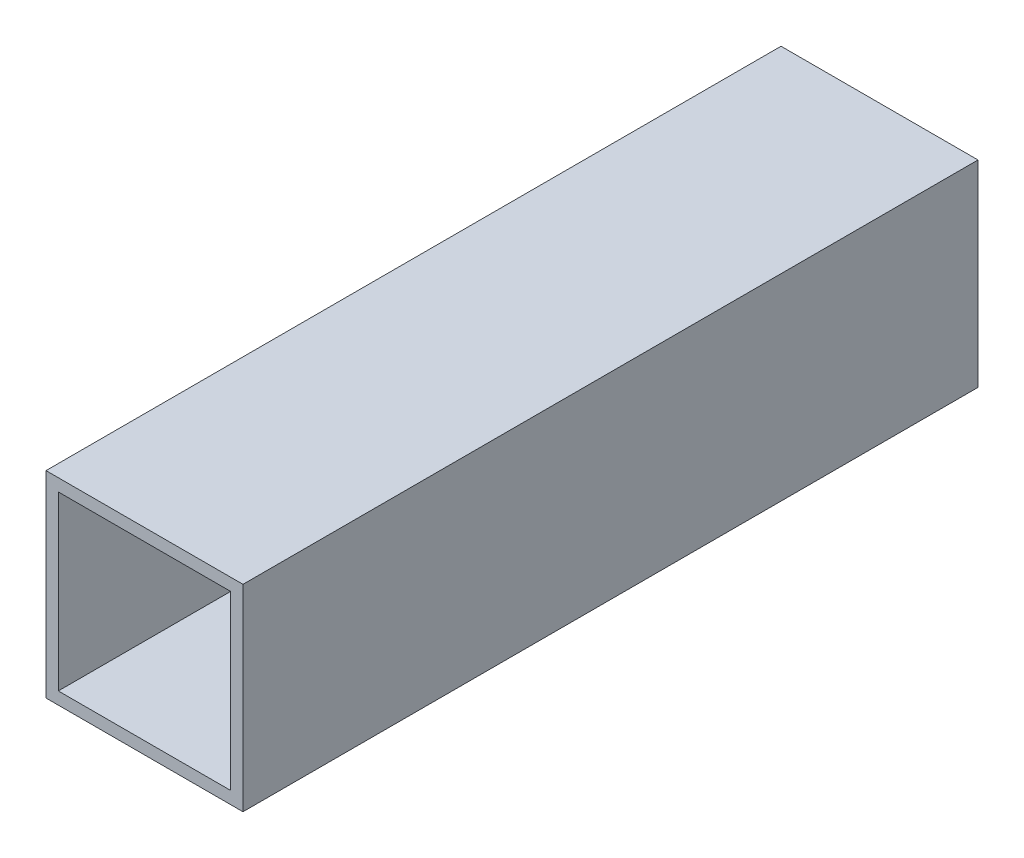
ISO-10303-21;
HEADER;
FILE_DESCRIPTION(('STEP AP214'),'2;1');
FILE_NAME('part.step','',(''),(''),'','','');
FILE_SCHEMA(('AUTOMOTIVE_DESIGN { 1 0 10303 214 1 1 1 1 }'));
ENDSEC;
DATA;
#1=APPLICATION_CONTEXT('core data for automotive mechanical design processes');
#2=APPLICATION_PROTOCOL_DEFINITION('international standard','automotive_design',2000,#1);
#3=PRODUCT_CONTEXT('',#1,'mechanical');
#4=PRODUCT('Part','Part','',(#3));
#5=PRODUCT_RELATED_PRODUCT_CATEGORY('part','',(#4));
#6=PRODUCT_DEFINITION_FORMATION('','',#4);
#7=PRODUCT_DEFINITION_CONTEXT('part definition',#1,'design');
#8=PRODUCT_DEFINITION('design','',#6,#7);
#9=PRODUCT_DEFINITION_SHAPE('','',#8);
#10=(LENGTH_UNIT() NAMED_UNIT(*) SI_UNIT(.MILLI.,.METRE.));
#11=(NAMED_UNIT(*) PLANE_ANGLE_UNIT() SI_UNIT($,.RADIAN.));
#12=(NAMED_UNIT(*) SI_UNIT($,.STERADIAN.) SOLID_ANGLE_UNIT());
#13=UNCERTAINTY_MEASURE_WITH_UNIT(LENGTH_MEASURE(1.E-05),#10,'distance_accuracy_value','');
#14=(GEOMETRIC_REPRESENTATION_CONTEXT(3) GLOBAL_UNCERTAINTY_ASSIGNED_CONTEXT((#13)) GLOBAL_UNIT_ASSIGNED_CONTEXT((#10,
#11,#12)) REPRESENTATION_CONTEXT('',''));
#15=CARTESIAN_POINT('',(0.,0.,0.));
#16=DIRECTION('',(0.,0.,1.));
#17=DIRECTION('',(1.,0.,0.));
#18=AXIS2_PLACEMENT_3D('',#15,#16,#17);
#19=CARTESIAN_POINT('',(0.,0.,94.78));
#20=DIRECTION('',(0.,0.,-1.));
#21=DIRECTION('',(-1.,0.,0.));
#22=AXIS2_PLACEMENT_3D('',#19,#20,#21);
#23=PLANE('',#22);
#24=DIRECTION('',(0.,1.,0.));
#25=VECTOR('',#24,1.);
#26=CARTESIAN_POINT('',(12.7,-12.7,94.78));
#27=LINE('',#26,#25);
#28=CARTESIAN_POINT('',(12.7,-12.7,94.78));
#29=VERTEX_POINT('',#28);
#30=CARTESIAN_POINT('',(12.7,12.7,94.78));
#31=VERTEX_POINT('',#30);
#32=EDGE_CURVE('E134',#29,#31,#27,.T.);
#33=ORIENTED_EDGE('',*,*,#32,.T.);
#34=DIRECTION('',(-1.,0.,0.));
#35=VECTOR('',#34,1.);
#36=CARTESIAN_POINT('',(-12.7,12.7,94.78));
#37=LINE('',#36,#35);
#38=CARTESIAN_POINT('',(-12.7,12.7,94.78));
#39=VERTEX_POINT('',#38);
#40=EDGE_CURVE('E137',#31,#39,#37,.T.);
#41=ORIENTED_EDGE('',*,*,#40,.T.);
#42=DIRECTION('',(0.,-1.,0.));
#43=VECTOR('',#42,1.);
#44=CARTESIAN_POINT('',(-12.7,-12.7,94.78));
#45=LINE('',#44,#43);
#46=CARTESIAN_POINT('',(-12.7,-12.7,94.78));
#47=VERTEX_POINT('',#46);
#48=EDGE_CURVE('E140',#39,#47,#45,.T.);
#49=ORIENTED_EDGE('',*,*,#48,.T.);
#50=DIRECTION('',(1.,0.,0.));
#51=VECTOR('',#50,1.);
#52=CARTESIAN_POINT('',(-12.7,-12.7,94.78));
#53=LINE('',#52,#51);
#54=EDGE_CURVE('E142',#47,#29,#53,.T.);
#55=ORIENTED_EDGE('',*,*,#54,.T.);
#56=EDGE_LOOP('',(#33,#41,#49,#55));
#57=FACE_BOUND('',#56,.T.);
#58=DIRECTION('',(0.,1.,0.));
#59=VECTOR('',#58,1.);
#60=CARTESIAN_POINT('',(11.1125,-11.1125000000001,94.78));
#61=LINE('',#60,#59);
#62=CARTESIAN_POINT('',(11.1125,-11.1125000000001,94.78));
#63=VERTEX_POINT('',#62);
#64=CARTESIAN_POINT('',(11.1125,11.1125,94.78));
#65=VERTEX_POINT('',#64);
#66=EDGE_CURVE('E98',#63,#65,#61,.T.);
#67=ORIENTED_EDGE('',*,*,#66,.F.);
#68=DIRECTION('',(1.,0.,0.));
#69=VECTOR('',#68,1.);
#70=CARTESIAN_POINT('',(-11.1125,-11.1125000000001,94.78));
#71=LINE('',#70,#69);
#72=CARTESIAN_POINT('',(-11.1125,-11.1125000000001,94.78));
#73=VERTEX_POINT('',#72);
#74=EDGE_CURVE('E120',#73,#63,#71,.T.);
#75=ORIENTED_EDGE('',*,*,#74,.F.);
#76=DIRECTION('',(0.,-1.,0.));
#77=VECTOR('',#76,1.);
#78=CARTESIAN_POINT('',(-11.1125,-11.1125000000001,94.78));
#79=LINE('',#78,#77);
#80=CARTESIAN_POINT('',(-11.1125,11.1125,94.78));
#81=VERTEX_POINT('',#80);
#82=EDGE_CURVE('E118',#81,#73,#79,.T.);
#83=ORIENTED_EDGE('',*,*,#82,.F.);
#84=DIRECTION('',(-1.,0.,0.));
#85=VECTOR('',#84,1.);
#86=CARTESIAN_POINT('',(-11.1125,11.1125,94.78));
#87=LINE('',#86,#85);
#88=EDGE_CURVE('E106',#65,#81,#87,.T.);
#89=ORIENTED_EDGE('',*,*,#88,.F.);
#90=EDGE_LOOP('',(#67,#75,#83,#89));
#91=FACE_BOUND('',#90,.T.);
#92=ADVANCED_FACE('F33',(#57,#91),#23,.F.);
#93=CARTESIAN_POINT('',(0.,0.,0.));
#94=DIRECTION('',(0.,0.,-1.));
#95=DIRECTION('',(-1.,0.,0.));
#96=AXIS2_PLACEMENT_3D('',#93,#94,#95);
#97=PLANE('',#96);
#98=DIRECTION('',(0.,1.,0.));
#99=VECTOR('',#98,1.);
#100=CARTESIAN_POINT('',(12.7,-12.7,0.));
#101=LINE('',#100,#99);
#102=CARTESIAN_POINT('',(12.7,-12.7,0.));
#103=VERTEX_POINT('',#102);
#104=CARTESIAN_POINT('',(12.7,12.7,0.));
#105=VERTEX_POINT('',#104);
#106=EDGE_CURVE('E114',#103,#105,#101,.T.);
#107=ORIENTED_EDGE('',*,*,#106,.F.);
#108=DIRECTION('',(1.,0.,0.));
#109=VECTOR('',#108,1.);
#110=CARTESIAN_POINT('',(-12.7,-12.7,0.));
#111=LINE('',#110,#109);
#112=CARTESIAN_POINT('',(-12.7,-12.7,0.));
#113=VERTEX_POINT('',#112);
#114=EDGE_CURVE('E138',#113,#103,#111,.T.);
#115=ORIENTED_EDGE('',*,*,#114,.F.);
#116=DIRECTION('',(0.,-1.,0.));
#117=VECTOR('',#116,1.);
#118=CARTESIAN_POINT('',(-12.7,-12.7,0.));
#119=LINE('',#118,#117);
#120=CARTESIAN_POINT('',(-12.7,12.7,0.));
#121=VERTEX_POINT('',#120);
#122=EDGE_CURVE('E149',#121,#113,#119,.T.);
#123=ORIENTED_EDGE('',*,*,#122,.F.);
#124=DIRECTION('',(-1.,0.,0.));
#125=VECTOR('',#124,1.);
#126=CARTESIAN_POINT('',(-12.7,12.7,0.));
#127=LINE('',#126,#125);
#128=EDGE_CURVE('E147',#105,#121,#127,.T.);
#129=ORIENTED_EDGE('',*,*,#128,.F.);
#130=EDGE_LOOP('',(#107,#115,#123,#129));
#131=FACE_BOUND('',#130,.T.);
#132=DIRECTION('',(1.,0.,0.));
#133=VECTOR('',#132,1.);
#134=CARTESIAN_POINT('',(-11.1125,-11.1125000000001,0.));
#135=LINE('',#134,#133);
#136=CARTESIAN_POINT('',(-11.1125,-11.1125000000001,0.));
#137=VERTEX_POINT('',#136);
#138=CARTESIAN_POINT('',(11.1125,-11.1125000000001,0.));
#139=VERTEX_POINT('',#138);
#140=EDGE_CURVE('E107',#137,#139,#135,.T.);
#141=ORIENTED_EDGE('',*,*,#140,.T.);
#142=DIRECTION('',(0.,1.,0.));
#143=VECTOR('',#142,1.);
#144=CARTESIAN_POINT('',(11.1125,-11.1125000000001,0.));
#145=LINE('',#144,#143);
#146=CARTESIAN_POINT('',(11.1125,11.1125,0.));
#147=VERTEX_POINT('',#146);
#148=EDGE_CURVE('E56',#139,#147,#145,.T.);
#149=ORIENTED_EDGE('',*,*,#148,.T.);
#150=DIRECTION('',(-1.,0.,0.));
#151=VECTOR('',#150,1.);
#152=CARTESIAN_POINT('',(-11.1125,11.1125,0.));
#153=LINE('',#152,#151);
#154=CARTESIAN_POINT('',(-11.1125,11.1125,0.));
#155=VERTEX_POINT('',#154);
#156=EDGE_CURVE('E113',#147,#155,#153,.T.);
#157=ORIENTED_EDGE('',*,*,#156,.T.);
#158=DIRECTION('',(0.,-1.,0.));
#159=VECTOR('',#158,1.);
#160=CARTESIAN_POINT('',(-11.1125,-11.1125000000001,0.));
#161=LINE('',#160,#159);
#162=EDGE_CURVE('E126',#155,#137,#161,.T.);
#163=ORIENTED_EDGE('',*,*,#162,.T.);
#164=EDGE_LOOP('',(#141,#149,#157,#163));
#165=FACE_BOUND('',#164,.T.);
#166=ADVANCED_FACE('F167',(#131,#165),#97,.T.);
#167=CARTESIAN_POINT('',(12.7,-12.7,94.78));
#168=DIRECTION('',(-1.,0.,0.));
#169=DIRECTION('',(0.,0.,1.));
#170=AXIS2_PLACEMENT_3D('',#167,#168,#169);
#171=PLANE('',#170);
#172=ORIENTED_EDGE('',*,*,#106,.T.);
#173=DIRECTION('',(0.,0.,-1.));
#174=VECTOR('',#173,1.);
#175=CARTESIAN_POINT('',(12.7,12.7,94.78));
#176=LINE('',#175,#174);
#177=EDGE_CURVE('E11',#31,#105,#176,.T.);
#178=ORIENTED_EDGE('',*,*,#177,.F.);
#179=ORIENTED_EDGE('',*,*,#32,.F.);
#180=DIRECTION('',(0.,0.,-1.));
#181=VECTOR('',#180,1.);
#182=CARTESIAN_POINT('',(12.7,-12.7,94.78));
#183=LINE('',#182,#181);
#184=EDGE_CURVE('E144',#29,#103,#183,.T.);
#185=ORIENTED_EDGE('',*,*,#184,.T.);
#186=EDGE_LOOP('',(#172,#178,#179,#185));
#187=FACE_BOUND('',#186,.T.);
#188=ADVANCED_FACE('F35',(#187),#171,.F.);
#189=CARTESIAN_POINT('',(-12.7,12.7,94.78));
#190=DIRECTION('',(0.,-1.,0.));
#191=DIRECTION('',(0.,0.,-1.));
#192=AXIS2_PLACEMENT_3D('',#189,#190,#191);
#193=PLANE('',#192);
#194=ORIENTED_EDGE('',*,*,#128,.T.);
#195=DIRECTION('',(0.,0.,-1.));
#196=VECTOR('',#195,1.);
#197=CARTESIAN_POINT('',(-12.7,12.7,94.78));
#198=LINE('',#197,#196);
#199=EDGE_CURVE('E41',#39,#121,#198,.T.);
#200=ORIENTED_EDGE('',*,*,#199,.F.);
#201=ORIENTED_EDGE('',*,*,#40,.F.);
#202=ORIENTED_EDGE('',*,*,#177,.T.);
#203=EDGE_LOOP('',(#194,#200,#201,#202));
#204=FACE_BOUND('',#203,.T.);
#205=ADVANCED_FACE('F177',(#204),#193,.F.);
#206=CARTESIAN_POINT('',(-12.7,-12.7,94.78));
#207=DIRECTION('',(1.,0.,0.));
#208=DIRECTION('',(0.,0.,-1.));
#209=AXIS2_PLACEMENT_3D('',#206,#207,#208);
#210=PLANE('',#209);
#211=ORIENTED_EDGE('',*,*,#122,.T.);
#212=DIRECTION('',(0.,0.,-1.));
#213=VECTOR('',#212,1.);
#214=CARTESIAN_POINT('',(-12.7,-12.7,94.78));
#215=LINE('',#214,#213);
#216=EDGE_CURVE('E154',#47,#113,#215,.T.);
#217=ORIENTED_EDGE('',*,*,#216,.F.);
#218=ORIENTED_EDGE('',*,*,#48,.F.);
#219=ORIENTED_EDGE('',*,*,#199,.T.);
#220=EDGE_LOOP('',(#211,#217,#218,#219));
#221=FACE_BOUND('',#220,.T.);
#222=ADVANCED_FACE('F161',(#221),#210,.F.);
#223=CARTESIAN_POINT('',(-12.7,-12.7,94.78));
#224=DIRECTION('',(0.,1.,0.));
#225=DIRECTION('',(0.,0.,1.));
#226=AXIS2_PLACEMENT_3D('',#223,#224,#225);
#227=PLANE('',#226);
#228=ORIENTED_EDGE('',*,*,#114,.T.);
#229=ORIENTED_EDGE('',*,*,#184,.F.);
#230=ORIENTED_EDGE('',*,*,#54,.F.);
#231=ORIENTED_EDGE('',*,*,#216,.T.);
#232=EDGE_LOOP('',(#228,#229,#230,#231));
#233=FACE_BOUND('',#232,.T.);
#234=ADVANCED_FACE('F171',(#233),#227,.F.);
#235=CARTESIAN_POINT('',(11.1125,-11.1125000000001,94.78));
#236=DIRECTION('',(-1.,0.,0.));
#237=DIRECTION('',(0.,0.,1.));
#238=AXIS2_PLACEMENT_3D('',#235,#236,#237);
#239=PLANE('',#238);
#240=ORIENTED_EDGE('',*,*,#148,.F.);
#241=DIRECTION('',(0.,0.,-1.));
#242=VECTOR('',#241,1.);
#243=CARTESIAN_POINT('',(11.1125,-11.1125000000001,94.78));
#244=LINE('',#243,#242);
#245=EDGE_CURVE('E102',#63,#139,#244,.T.);
#246=ORIENTED_EDGE('',*,*,#245,.F.);
#247=ORIENTED_EDGE('',*,*,#66,.T.);
#248=DIRECTION('',(0.,0.,-1.));
#249=VECTOR('',#248,1.);
#250=CARTESIAN_POINT('',(11.1125,11.1125,94.78));
#251=LINE('',#250,#249);
#252=EDGE_CURVE('E101',#65,#147,#251,.T.);
#253=ORIENTED_EDGE('',*,*,#252,.T.);
#254=EDGE_LOOP('',(#240,#246,#247,#253));
#255=FACE_BOUND('',#254,.T.);
#256=ADVANCED_FACE('F100',(#255),#239,.T.);
#257=CARTESIAN_POINT('',(-11.1125,11.1125,94.78));
#258=DIRECTION('',(0.,-1.,0.));
#259=DIRECTION('',(1.,0.,0.));
#260=AXIS2_PLACEMENT_3D('',#257,#258,#259);
#261=PLANE('',#260);
#262=ORIENTED_EDGE('',*,*,#156,.F.);
#263=ORIENTED_EDGE('',*,*,#252,.F.);
#264=ORIENTED_EDGE('',*,*,#88,.T.);
#265=DIRECTION('',(0.,0.,-1.));
#266=VECTOR('',#265,1.);
#267=CARTESIAN_POINT('',(-11.1125,11.1125,94.78));
#268=LINE('',#267,#266);
#269=EDGE_CURVE('E115',#81,#155,#268,.T.);
#270=ORIENTED_EDGE('',*,*,#269,.T.);
#271=EDGE_LOOP('',(#262,#263,#264,#270));
#272=FACE_BOUND('',#271,.T.);
#273=ADVANCED_FACE('F110',(#272),#261,.T.);
#274=CARTESIAN_POINT('',(-11.1125,-11.1125000000001,94.78));
#275=DIRECTION('',(1.,0.,0.));
#276=DIRECTION('',(0.,0.,-1.));
#277=AXIS2_PLACEMENT_3D('',#274,#275,#276);
#278=PLANE('',#277);
#279=ORIENTED_EDGE('',*,*,#162,.F.);
#280=ORIENTED_EDGE('',*,*,#269,.F.);
#281=ORIENTED_EDGE('',*,*,#82,.T.);
#282=DIRECTION('',(0.,0.,-1.));
#283=VECTOR('',#282,1.);
#284=CARTESIAN_POINT('',(-11.1125,-11.1125000000001,94.78));
#285=LINE('',#284,#283);
#286=EDGE_CURVE('E48',#73,#137,#285,.T.);
#287=ORIENTED_EDGE('',*,*,#286,.T.);
#288=EDGE_LOOP('',(#279,#280,#281,#287));
#289=FACE_BOUND('',#288,.T.);
#290=ADVANCED_FACE('F200',(#289),#278,.T.);
#291=CARTESIAN_POINT('',(-11.1125,-11.1125000000001,94.78));
#292=DIRECTION('',(0.,1.,0.));
#293=DIRECTION('',(0.,0.,1.));
#294=AXIS2_PLACEMENT_3D('',#291,#292,#293);
#295=PLANE('',#294);
#296=ORIENTED_EDGE('',*,*,#140,.F.);
#297=ORIENTED_EDGE('',*,*,#286,.F.);
#298=ORIENTED_EDGE('',*,*,#74,.T.);
#299=ORIENTED_EDGE('',*,*,#245,.T.);
#300=EDGE_LOOP('',(#296,#297,#298,#299));
#301=FACE_BOUND('',#300,.T.);
#302=ADVANCED_FACE('F204',(#301),#295,.T.);
#303=CLOSED_SHELL('',(#92,#166,#188,#205,#222,#234,#256,#273,#290,#302));
#304=MANIFOLD_SOLID_BREP('B2',#303);
#305=ADVANCED_BREP_SHAPE_REPRESENTATION('',(#18,#304),#14);
#306=SHAPE_DEFINITION_REPRESENTATION(#9,#305);
ENDSEC;
END-ISO-10303-21;
